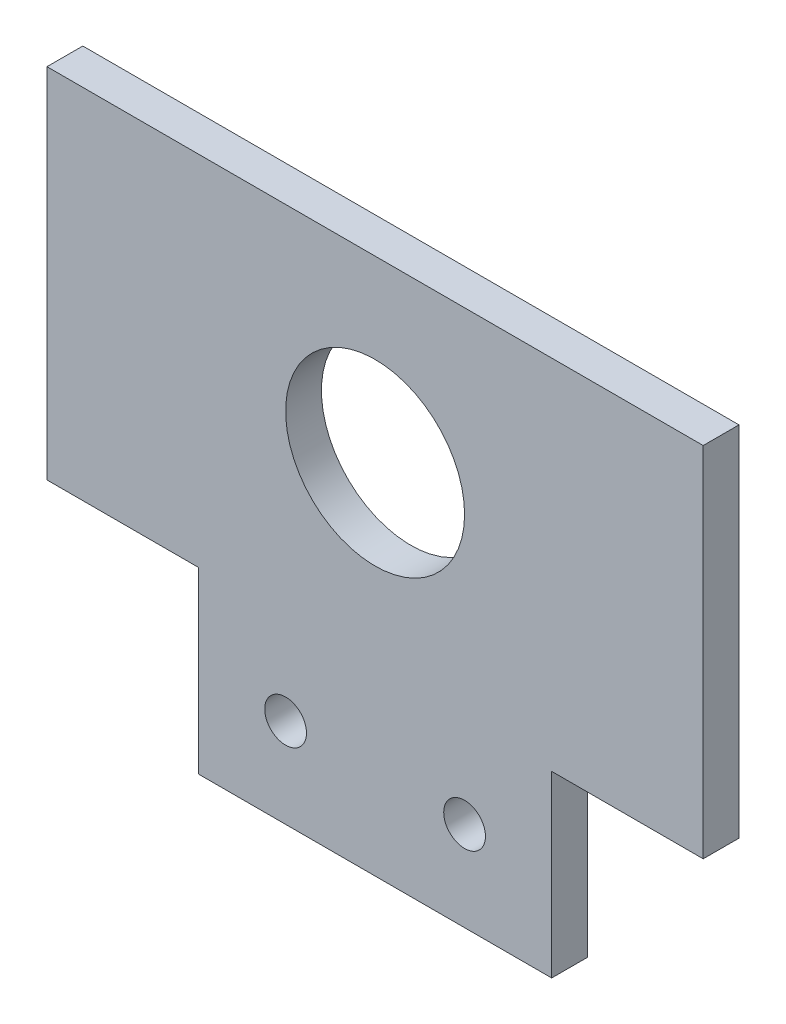
ISO-10303-21;
HEADER;
FILE_DESCRIPTION(('STEP AP214'),'2;1');
FILE_NAME('part.step','',(''),(''),'','','');
FILE_SCHEMA(('AUTOMOTIVE_DESIGN { 1 0 10303 214 1 1 1 1 }'));
ENDSEC;
DATA;
#1=APPLICATION_CONTEXT('core data for automotive mechanical design processes');
#2=APPLICATION_PROTOCOL_DEFINITION('international standard','automotive_design',2000,#1);
#3=PRODUCT_CONTEXT('',#1,'mechanical');
#4=PRODUCT('Part','Part','',(#3));
#5=PRODUCT_RELATED_PRODUCT_CATEGORY('part','',(#4));
#6=PRODUCT_DEFINITION_FORMATION('','',#4);
#7=PRODUCT_DEFINITION_CONTEXT('part definition',#1,'design');
#8=PRODUCT_DEFINITION('design','',#6,#7);
#9=PRODUCT_DEFINITION_SHAPE('','',#8);
#10=(LENGTH_UNIT() NAMED_UNIT(*) SI_UNIT(.MILLI.,.METRE.));
#11=(NAMED_UNIT(*) PLANE_ANGLE_UNIT() SI_UNIT($,.RADIAN.));
#12=(NAMED_UNIT(*) SI_UNIT($,.STERADIAN.) SOLID_ANGLE_UNIT());
#13=UNCERTAINTY_MEASURE_WITH_UNIT(LENGTH_MEASURE(1.E-05),#10,'distance_accuracy_value','');
#14=(GEOMETRIC_REPRESENTATION_CONTEXT(3) GLOBAL_UNCERTAINTY_ASSIGNED_CONTEXT((#13)) GLOBAL_UNIT_ASSIGNED_CONTEXT((#10,
#11,#12)) REPRESENTATION_CONTEXT('',''));
#15=CARTESIAN_POINT('',(0.,0.,0.));
#16=DIRECTION('',(0.,0.,1.));
#17=DIRECTION('',(1.,0.,0.));
#18=AXIS2_PLACEMENT_3D('',#15,#16,#17);
#19=CARTESIAN_POINT('',(0.,0.,3.));
#20=DIRECTION('',(0.,0.,-1.));
#21=DIRECTION('',(-1.,0.,0.));
#22=AXIS2_PLACEMENT_3D('',#19,#20,#21);
#23=PLANE('',#22);
#24=CARTESIAN_POINT('',(7.5,-7.49999999999995,3.));
#25=DIRECTION('',(0.,0.,1.));
#26=DIRECTION('',(-1.,0.,0.));
#27=AXIS2_PLACEMENT_3D('',#24,#25,#26);
#28=CIRCLE('',#27,1.75);
#29=CARTESIAN_POINT('',(5.75,-7.49999999999995,3.));
#30=VERTEX_POINT('',#29);
#31=EDGE_CURVE('E193',#30,#30,#28,.T.);
#32=ORIENTED_EDGE('',*,*,#31,.F.);
#33=EDGE_LOOP('',(#32));
#34=FACE_BOUND('',#33,.T.);
#35=CARTESIAN_POINT('',(-7.5,-7.49999999999995,3.));
#36=DIRECTION('',(0.,0.,1.));
#37=DIRECTION('',(1.,0.,0.));
#38=AXIS2_PLACEMENT_3D('',#35,#36,#37);
#39=CIRCLE('',#38,1.75);
#40=CARTESIAN_POINT('',(-5.75,-7.49999999999995,3.));
#41=VERTEX_POINT('',#40);
#42=EDGE_CURVE('E187',#41,#41,#39,.T.);
#43=ORIENTED_EDGE('',*,*,#42,.F.);
#44=EDGE_LOOP('',(#43));
#45=FACE_BOUND('',#44,.T.);
#46=DIRECTION('',(0.,1.,0.));
#47=VECTOR('',#46,1.);
#48=CARTESIAN_POINT('',(27.5,0.,3.));
#49=LINE('',#48,#47);
#50=CARTESIAN_POINT('',(27.5,0.,3.));
#51=VERTEX_POINT('',#50);
#52=CARTESIAN_POINT('',(27.5,30.,3.));
#53=VERTEX_POINT('',#52);
#54=EDGE_CURVE('E147',#51,#53,#49,.T.);
#55=ORIENTED_EDGE('',*,*,#54,.T.);
#56=DIRECTION('',(-1.,0.,0.));
#57=VECTOR('',#56,1.);
#58=CARTESIAN_POINT('',(-27.5,30.,3.));
#59=LINE('',#58,#57);
#60=CARTESIAN_POINT('',(-27.5,30.,3.));
#61=VERTEX_POINT('',#60);
#62=EDGE_CURVE('E95',#53,#61,#59,.T.);
#63=ORIENTED_EDGE('',*,*,#62,.T.);
#64=DIRECTION('',(0.,-1.,0.));
#65=VECTOR('',#64,1.);
#66=CARTESIAN_POINT('',(-27.5,0.,3.));
#67=LINE('',#66,#65);
#68=CARTESIAN_POINT('',(-27.5,0.,3.));
#69=VERTEX_POINT('',#68);
#70=EDGE_CURVE('E162',#61,#69,#67,.T.);
#71=ORIENTED_EDGE('',*,*,#70,.T.);
#72=DIRECTION('',(1.,0.,0.));
#73=VECTOR('',#72,1.);
#74=CARTESIAN_POINT('',(-14.8,0.,3.));
#75=LINE('',#74,#73);
#76=CARTESIAN_POINT('',(-14.8,0.,3.));
#77=VERTEX_POINT('',#76);
#78=EDGE_CURVE('E175',#69,#77,#75,.T.);
#79=ORIENTED_EDGE('',*,*,#78,.T.);
#80=DIRECTION('',(0.,-1.,0.));
#81=VECTOR('',#80,1.);
#82=CARTESIAN_POINT('',(-14.8,0.,3.));
#83=LINE('',#82,#81);
#84=CARTESIAN_POINT('',(-14.8,-15.,3.));
#85=VERTEX_POINT('',#84);
#86=EDGE_CURVE('E114',#77,#85,#83,.T.);
#87=ORIENTED_EDGE('',*,*,#86,.T.);
#88=DIRECTION('',(1.,0.,0.));
#89=VECTOR('',#88,1.);
#90=CARTESIAN_POINT('',(-14.8,-15.,3.));
#91=LINE('',#90,#89);
#92=CARTESIAN_POINT('',(14.8,-15.,3.));
#93=VERTEX_POINT('',#92);
#94=EDGE_CURVE('E108',#85,#93,#91,.T.);
#95=ORIENTED_EDGE('',*,*,#94,.T.);
#96=DIRECTION('',(0.,1.,0.));
#97=VECTOR('',#96,1.);
#98=CARTESIAN_POINT('',(14.8,0.,3.));
#99=LINE('',#98,#97);
#100=CARTESIAN_POINT('',(14.8,0.,3.));
#101=VERTEX_POINT('',#100);
#102=EDGE_CURVE('E112',#93,#101,#99,.T.);
#103=ORIENTED_EDGE('',*,*,#102,.T.);
#104=DIRECTION('',(1.,0.,0.));
#105=VECTOR('',#104,1.);
#106=CARTESIAN_POINT('',(14.8,0.,3.));
#107=LINE('',#106,#105);
#108=EDGE_CURVE('E52',#101,#51,#107,.T.);
#109=ORIENTED_EDGE('',*,*,#108,.T.);
#110=EDGE_LOOP('',(#55,#63,#71,#79,#87,#95,#103,#109));
#111=FACE_BOUND('',#110,.T.);
#112=CARTESIAN_POINT('',(0.,15.,3.));
#113=DIRECTION('',(0.,0.,1.));
#114=DIRECTION('',(1.,0.,0.));
#115=AXIS2_PLACEMENT_3D('',#112,#113,#114);
#116=CIRCLE('',#115,7.5);
#117=CARTESIAN_POINT('',(7.5,15.,3.));
#118=VERTEX_POINT('',#117);
#119=EDGE_CURVE('E136',#118,#118,#116,.T.);
#120=ORIENTED_EDGE('',*,*,#119,.F.);
#121=EDGE_LOOP('',(#120));
#122=FACE_BOUND('',#121,.T.);
#123=ADVANCED_FACE('F35',(#34,#45,#111,#122),#23,.F.);
#124=CARTESIAN_POINT('',(0.,0.,0.));
#125=DIRECTION('',(0.,0.,-1.));
#126=DIRECTION('',(-1.,0.,0.));
#127=AXIS2_PLACEMENT_3D('',#124,#125,#126);
#128=PLANE('',#127);
#129=CARTESIAN_POINT('',(7.5,-7.49999999999995,0.));
#130=DIRECTION('',(0.,0.,1.));
#131=DIRECTION('',(-1.,0.,0.));
#132=AXIS2_PLACEMENT_3D('',#129,#130,#131);
#133=CIRCLE('',#132,1.75);
#134=CARTESIAN_POINT('',(5.75,-7.49999999999995,0.));
#135=VERTEX_POINT('',#134);
#136=EDGE_CURVE('E190',#135,#135,#133,.T.);
#137=ORIENTED_EDGE('',*,*,#136,.T.);
#138=EDGE_LOOP('',(#137));
#139=FACE_BOUND('',#138,.T.);
#140=CARTESIAN_POINT('',(-7.5,-7.49999999999995,0.));
#141=DIRECTION('',(0.,0.,1.));
#142=DIRECTION('',(1.,0.,0.));
#143=AXIS2_PLACEMENT_3D('',#140,#141,#142);
#144=CIRCLE('',#143,1.75);
#145=CARTESIAN_POINT('',(-5.75,-7.49999999999995,0.));
#146=VERTEX_POINT('',#145);
#147=EDGE_CURVE('E184',#146,#146,#144,.T.);
#148=ORIENTED_EDGE('',*,*,#147,.T.);
#149=EDGE_LOOP('',(#148));
#150=FACE_BOUND('',#149,.T.);
#151=DIRECTION('',(0.,1.,0.));
#152=VECTOR('',#151,1.);
#153=CARTESIAN_POINT('',(27.5,0.,0.));
#154=LINE('',#153,#152);
#155=CARTESIAN_POINT('',(27.5,0.,0.));
#156=VERTEX_POINT('',#155);
#157=CARTESIAN_POINT('',(27.5,30.,0.));
#158=VERTEX_POINT('',#157);
#159=EDGE_CURVE('E132',#156,#158,#154,.T.);
#160=ORIENTED_EDGE('',*,*,#159,.F.);
#161=DIRECTION('',(1.,0.,0.));
#162=VECTOR('',#161,1.);
#163=CARTESIAN_POINT('',(14.8,0.,0.));
#164=LINE('',#163,#162);
#165=CARTESIAN_POINT('',(14.8,0.,0.));
#166=VERTEX_POINT('',#165);
#167=EDGE_CURVE('E87',#166,#156,#164,.T.);
#168=ORIENTED_EDGE('',*,*,#167,.F.);
#169=DIRECTION('',(0.,1.,0.));
#170=VECTOR('',#169,1.);
#171=CARTESIAN_POINT('',(14.8,0.,0.));
#172=LINE('',#171,#170);
#173=CARTESIAN_POINT('',(14.8,-15.,0.));
#174=VERTEX_POINT('',#173);
#175=EDGE_CURVE('E81',#174,#166,#172,.T.);
#176=ORIENTED_EDGE('',*,*,#175,.F.);
#177=DIRECTION('',(1.,0.,0.));
#178=VECTOR('',#177,1.);
#179=CARTESIAN_POINT('',(-14.8,-15.,0.));
#180=LINE('',#179,#178);
#181=CARTESIAN_POINT('',(-14.8,-15.,0.));
#182=VERTEX_POINT('',#181);
#183=EDGE_CURVE('E122',#182,#174,#180,.T.);
#184=ORIENTED_EDGE('',*,*,#183,.F.);
#185=DIRECTION('',(0.,-1.,0.));
#186=VECTOR('',#185,1.);
#187=CARTESIAN_POINT('',(-14.8,0.,0.));
#188=LINE('',#187,#186);
#189=CARTESIAN_POINT('',(-14.8,0.,0.));
#190=VERTEX_POINT('',#189);
#191=EDGE_CURVE('E142',#190,#182,#188,.T.);
#192=ORIENTED_EDGE('',*,*,#191,.F.);
#193=DIRECTION('',(1.,0.,0.));
#194=VECTOR('',#193,1.);
#195=CARTESIAN_POINT('',(-14.8,0.,0.));
#196=LINE('',#195,#194);
#197=CARTESIAN_POINT('',(-27.5,0.,0.));
#198=VERTEX_POINT('',#197);
#199=EDGE_CURVE('E140',#198,#190,#196,.T.);
#200=ORIENTED_EDGE('',*,*,#199,.F.);
#201=DIRECTION('',(0.,-1.,0.));
#202=VECTOR('',#201,1.);
#203=CARTESIAN_POINT('',(-27.5,0.,0.));
#204=LINE('',#203,#202);
#205=CARTESIAN_POINT('',(-27.5,30.,0.));
#206=VERTEX_POINT('',#205);
#207=EDGE_CURVE('E138',#206,#198,#204,.T.);
#208=ORIENTED_EDGE('',*,*,#207,.F.);
#209=DIRECTION('',(-1.,0.,0.));
#210=VECTOR('',#209,1.);
#211=CARTESIAN_POINT('',(-27.5,30.,0.));
#212=LINE('',#211,#210);
#213=EDGE_CURVE('E135',#158,#206,#212,.T.);
#214=ORIENTED_EDGE('',*,*,#213,.F.);
#215=EDGE_LOOP('',(#160,#168,#176,#184,#192,#200,#208,#214));
#216=FACE_BOUND('',#215,.T.);
#217=CARTESIAN_POINT('',(0.,15.,0.));
#218=DIRECTION('',(0.,0.,1.));
#219=DIRECTION('',(1.,0.,0.));
#220=AXIS2_PLACEMENT_3D('',#217,#218,#219);
#221=CIRCLE('',#220,7.5);
#222=CARTESIAN_POINT('',(7.5,15.,0.));
#223=VERTEX_POINT('',#222);
#224=EDGE_CURVE('E181',#223,#223,#221,.T.);
#225=ORIENTED_EDGE('',*,*,#224,.T.);
#226=EDGE_LOOP('',(#225));
#227=FACE_BOUND('',#226,.T.);
#228=ADVANCED_FACE('F166',(#139,#150,#216,#227),#128,.T.);
#229=CARTESIAN_POINT('',(27.5,0.,3.));
#230=DIRECTION('',(-1.,0.,0.));
#231=DIRECTION('',(0.,-1.,0.));
#232=AXIS2_PLACEMENT_3D('',#229,#230,#231);
#233=PLANE('',#232);
#234=ORIENTED_EDGE('',*,*,#159,.T.);
#235=DIRECTION('',(0.,0.,-1.));
#236=VECTOR('',#235,1.);
#237=CARTESIAN_POINT('',(27.5,30.,3.));
#238=LINE('',#237,#236);
#239=EDGE_CURVE('E11',#53,#158,#238,.T.);
#240=ORIENTED_EDGE('',*,*,#239,.F.);
#241=ORIENTED_EDGE('',*,*,#54,.F.);
#242=DIRECTION('',(0.,0.,-1.));
#243=VECTOR('',#242,1.);
#244=CARTESIAN_POINT('',(27.5,0.,3.));
#245=LINE('',#244,#243);
#246=EDGE_CURVE('E128',#51,#156,#245,.T.);
#247=ORIENTED_EDGE('',*,*,#246,.T.);
#248=EDGE_LOOP('',(#234,#240,#241,#247));
#249=FACE_BOUND('',#248,.T.);
#250=ADVANCED_FACE('F37',(#249),#233,.F.);
#251=CARTESIAN_POINT('',(-27.5,30.,3.));
#252=DIRECTION('',(0.,-1.,0.));
#253=DIRECTION('',(0.,0.,-1.));
#254=AXIS2_PLACEMENT_3D('',#251,#252,#253);
#255=PLANE('',#254);
#256=ORIENTED_EDGE('',*,*,#213,.T.);
#257=DIRECTION('',(0.,0.,-1.));
#258=VECTOR('',#257,1.);
#259=CARTESIAN_POINT('',(-27.5,30.,3.));
#260=LINE('',#259,#258);
#261=EDGE_CURVE('E44',#61,#206,#260,.T.);
#262=ORIENTED_EDGE('',*,*,#261,.F.);
#263=ORIENTED_EDGE('',*,*,#62,.F.);
#264=ORIENTED_EDGE('',*,*,#239,.T.);
#265=EDGE_LOOP('',(#256,#262,#263,#264));
#266=FACE_BOUND('',#265,.T.);
#267=ADVANCED_FACE('F238',(#266),#255,.F.);
#268=CARTESIAN_POINT('',(-27.5,0.,3.));
#269=DIRECTION('',(1.,0.,0.));
#270=DIRECTION('',(0.,0.,-1.));
#271=AXIS2_PLACEMENT_3D('',#268,#269,#270);
#272=PLANE('',#271);
#273=ORIENTED_EDGE('',*,*,#207,.T.);
#274=DIRECTION('',(0.,0.,-1.));
#275=VECTOR('',#274,1.);
#276=CARTESIAN_POINT('',(-27.5,0.,3.));
#277=LINE('',#276,#275);
#278=EDGE_CURVE('E154',#69,#198,#277,.T.);
#279=ORIENTED_EDGE('',*,*,#278,.F.);
#280=ORIENTED_EDGE('',*,*,#70,.F.);
#281=ORIENTED_EDGE('',*,*,#261,.T.);
#282=EDGE_LOOP('',(#273,#279,#280,#281));
#283=FACE_BOUND('',#282,.T.);
#284=ADVANCED_FACE('F160',(#283),#272,.F.);
#285=CARTESIAN_POINT('',(-14.8,0.,3.));
#286=DIRECTION('',(0.,1.,0.));
#287=DIRECTION('',(-1.,0.,0.));
#288=AXIS2_PLACEMENT_3D('',#285,#286,#287);
#289=PLANE('',#288);
#290=ORIENTED_EDGE('',*,*,#199,.T.);
#291=DIRECTION('',(0.,0.,-1.));
#292=VECTOR('',#291,1.);
#293=CARTESIAN_POINT('',(-14.8,0.,3.));
#294=LINE('',#293,#292);
#295=EDGE_CURVE('E151',#77,#190,#294,.T.);
#296=ORIENTED_EDGE('',*,*,#295,.F.);
#297=ORIENTED_EDGE('',*,*,#78,.F.);
#298=ORIENTED_EDGE('',*,*,#278,.T.);
#299=EDGE_LOOP('',(#290,#296,#297,#298));
#300=FACE_BOUND('',#299,.T.);
#301=ADVANCED_FACE('F171',(#300),#289,.F.);
#302=CARTESIAN_POINT('',(-14.8,0.,3.));
#303=DIRECTION('',(1.,0.,0.));
#304=DIRECTION('',(0.,0.,-1.));
#305=AXIS2_PLACEMENT_3D('',#302,#303,#304);
#306=PLANE('',#305);
#307=ORIENTED_EDGE('',*,*,#191,.T.);
#308=DIRECTION('',(0.,0.,-1.));
#309=VECTOR('',#308,1.);
#310=CARTESIAN_POINT('',(-14.8,-15.,3.));
#311=LINE('',#310,#309);
#312=EDGE_CURVE('E123',#85,#182,#311,.T.);
#313=ORIENTED_EDGE('',*,*,#312,.F.);
#314=ORIENTED_EDGE('',*,*,#86,.F.);
#315=ORIENTED_EDGE('',*,*,#295,.T.);
#316=EDGE_LOOP('',(#307,#313,#314,#315));
#317=FACE_BOUND('',#316,.T.);
#318=ADVANCED_FACE('F174',(#317),#306,.F.);
#319=CARTESIAN_POINT('',(-14.8,-15.,3.));
#320=DIRECTION('',(0.,1.,0.));
#321=DIRECTION('',(0.,0.,1.));
#322=AXIS2_PLACEMENT_3D('',#319,#320,#321);
#323=PLANE('',#322);
#324=ORIENTED_EDGE('',*,*,#183,.T.);
#325=DIRECTION('',(0.,0.,-1.));
#326=VECTOR('',#325,1.);
#327=CARTESIAN_POINT('',(14.8,-15.,3.));
#328=LINE('',#327,#326);
#329=EDGE_CURVE('E119',#93,#174,#328,.T.);
#330=ORIENTED_EDGE('',*,*,#329,.F.);
#331=ORIENTED_EDGE('',*,*,#94,.F.);
#332=ORIENTED_EDGE('',*,*,#312,.T.);
#333=EDGE_LOOP('',(#324,#330,#331,#332));
#334=FACE_BOUND('',#333,.T.);
#335=ADVANCED_FACE('F120',(#334),#323,.F.);
#336=CARTESIAN_POINT('',(14.8,0.,3.));
#337=DIRECTION('',(-1.,0.,0.));
#338=DIRECTION('',(0.,0.,1.));
#339=AXIS2_PLACEMENT_3D('',#336,#337,#338);
#340=PLANE('',#339);
#341=ORIENTED_EDGE('',*,*,#175,.T.);
#342=DIRECTION('',(0.,0.,-1.));
#343=VECTOR('',#342,1.);
#344=CARTESIAN_POINT('',(14.8,0.,3.));
#345=LINE('',#344,#343);
#346=EDGE_CURVE('E124',#101,#166,#345,.T.);
#347=ORIENTED_EDGE('',*,*,#346,.F.);
#348=ORIENTED_EDGE('',*,*,#102,.F.);
#349=ORIENTED_EDGE('',*,*,#329,.T.);
#350=EDGE_LOOP('',(#341,#347,#348,#349));
#351=FACE_BOUND('',#350,.T.);
#352=ADVANCED_FACE('F126',(#351),#340,.F.);
#353=CARTESIAN_POINT('',(14.8,0.,3.));
#354=DIRECTION('',(0.,1.,0.));
#355=DIRECTION('',(-1.,0.,0.));
#356=AXIS2_PLACEMENT_3D('',#353,#354,#355);
#357=PLANE('',#356);
#358=ORIENTED_EDGE('',*,*,#167,.T.);
#359=ORIENTED_EDGE('',*,*,#246,.F.);
#360=ORIENTED_EDGE('',*,*,#108,.F.);
#361=ORIENTED_EDGE('',*,*,#346,.T.);
#362=EDGE_LOOP('',(#358,#359,#360,#361));
#363=FACE_BOUND('',#362,.T.);
#364=ADVANCED_FACE('F220',(#363),#357,.F.);
#365=CARTESIAN_POINT('',(0.,15.,3.));
#366=DIRECTION('',(0.,0.,-1.));
#367=DIRECTION('',(-1.,0.,0.));
#368=AXIS2_PLACEMENT_3D('',#365,#366,#367);
#369=CYLINDRICAL_SURFACE('',#368,7.5);
#370=ORIENTED_EDGE('',*,*,#119,.T.);
#371=EDGE_LOOP('',(#370));
#372=FACE_BOUND('',#371,.T.);
#373=ORIENTED_EDGE('',*,*,#224,.F.);
#374=EDGE_LOOP('',(#373));
#375=FACE_BOUND('',#374,.T.);
#376=ADVANCED_FACE('F214',(#372,#375),#369,.F.);
#377=CARTESIAN_POINT('',(-7.5,-7.49999999999995,0.));
#378=DIRECTION('',(0.,0.,1.));
#379=DIRECTION('',(1.,0.,0.));
#380=AXIS2_PLACEMENT_3D('',#377,#378,#379);
#381=CYLINDRICAL_SURFACE('',#380,1.75);
#382=ORIENTED_EDGE('',*,*,#147,.F.);
#383=EDGE_LOOP('',(#382));
#384=FACE_BOUND('',#383,.T.);
#385=ORIENTED_EDGE('',*,*,#42,.T.);
#386=EDGE_LOOP('',(#385));
#387=FACE_BOUND('',#386,.T.);
#388=ADVANCED_FACE('F204',(#384,#387),#381,.F.);
#389=CARTESIAN_POINT('',(7.5,-7.49999999999995,0.));
#390=DIRECTION('',(0.,0.,1.));
#391=DIRECTION('',(1.,0.,0.));
#392=AXIS2_PLACEMENT_3D('',#389,#390,#391);
#393=CYLINDRICAL_SURFACE('',#392,1.75);
#394=ORIENTED_EDGE('',*,*,#136,.F.);
#395=EDGE_LOOP('',(#394));
#396=FACE_BOUND('',#395,.T.);
#397=ORIENTED_EDGE('',*,*,#31,.T.);
#398=EDGE_LOOP('',(#397));
#399=FACE_BOUND('',#398,.T.);
#400=ADVANCED_FACE('F201',(#396,#399),#393,.F.);
#401=CLOSED_SHELL('',(#123,#228,#250,#267,#284,#301,#318,#335,#352,#364,#376,#388,#400));
#402=MANIFOLD_SOLID_BREP('B2',#401);
#403=ADVANCED_BREP_SHAPE_REPRESENTATION('',(#18,#402),#14);
#404=SHAPE_DEFINITION_REPRESENTATION(#9,#403);
ENDSEC;
END-ISO-10303-21;
